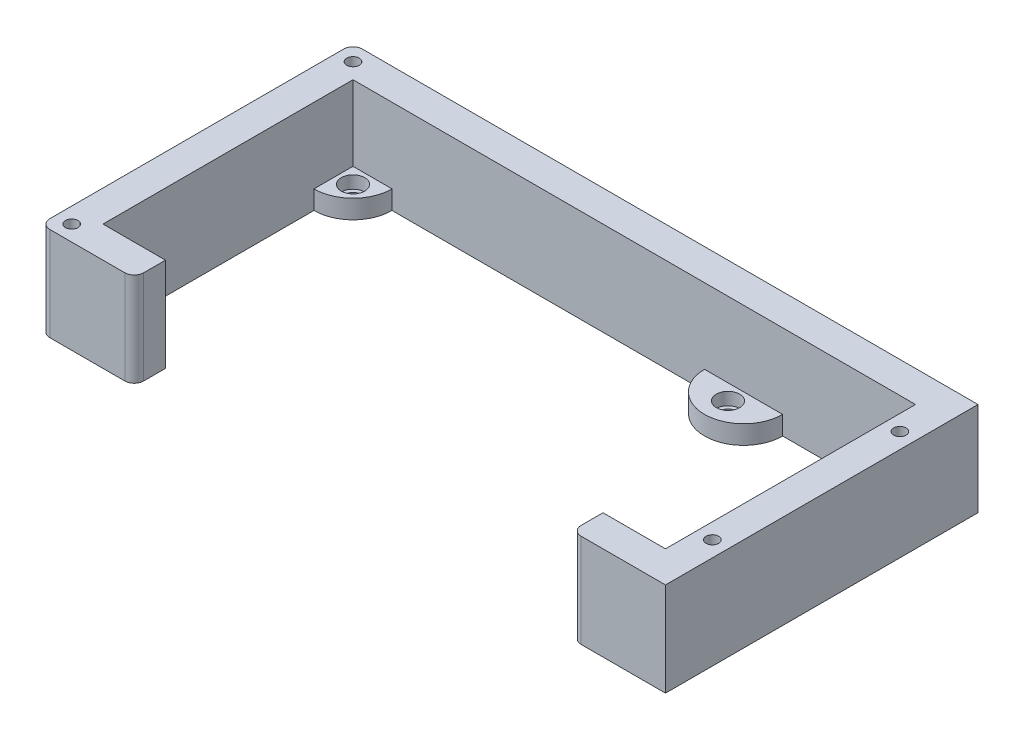
ISO-10303-21;
HEADER;
FILE_DESCRIPTION(('STEP AP214'),'2;1');
FILE_NAME('part.step','',(''),(''),'','','');
FILE_SCHEMA(('AUTOMOTIVE_DESIGN { 1 0 10303 214 1 1 1 1 }'));
ENDSEC;
DATA;
#1=APPLICATION_CONTEXT('core data for automotive mechanical design processes');
#2=APPLICATION_PROTOCOL_DEFINITION('international standard','automotive_design',2000,#1);
#3=PRODUCT_CONTEXT('',#1,'mechanical');
#4=PRODUCT('Part','Part','',(#3));
#5=PRODUCT_RELATED_PRODUCT_CATEGORY('part','',(#4));
#6=PRODUCT_DEFINITION_FORMATION('','',#4);
#7=PRODUCT_DEFINITION_CONTEXT('part definition',#1,'design');
#8=PRODUCT_DEFINITION('design','',#6,#7);
#9=PRODUCT_DEFINITION_SHAPE('','',#8);
#10=(LENGTH_UNIT() NAMED_UNIT(*) SI_UNIT(.MILLI.,.METRE.));
#11=(NAMED_UNIT(*) PLANE_ANGLE_UNIT() SI_UNIT($,.RADIAN.));
#12=(NAMED_UNIT(*) SI_UNIT($,.STERADIAN.) SOLID_ANGLE_UNIT());
#13=UNCERTAINTY_MEASURE_WITH_UNIT(LENGTH_MEASURE(1.E-05),#10,'distance_accuracy_value','');
#14=(GEOMETRIC_REPRESENTATION_CONTEXT(3) GLOBAL_UNCERTAINTY_ASSIGNED_CONTEXT((#13)) GLOBAL_UNIT_ASSIGNED_CONTEXT((#10,
#11,#12)) REPRESENTATION_CONTEXT('',''));
#15=CARTESIAN_POINT('',(0.,0.,0.));
#16=DIRECTION('',(0.,0.,1.));
#17=DIRECTION('',(1.,0.,0.));
#18=AXIS2_PLACEMENT_3D('',#15,#16,#17);
#19=CARTESIAN_POINT('',(-90.,30.,40.));
#20=DIRECTION('',(0.,0.,-1.));
#21=DIRECTION('',(-1.,0.,0.));
#22=AXIS2_PLACEMENT_3D('',#19,#20,#21);
#23=PLANE('',#22);
#24=DIRECTION('',(0.,1.,0.));
#25=VECTOR('',#24,1.);
#26=CARTESIAN_POINT('',(70.,0.,40.));
#27=LINE('',#26,#25);
#28=CARTESIAN_POINT('',(70.,0.,40.));
#29=VERTEX_POINT('',#28);
#30=CARTESIAN_POINT('',(70.,30.,40.));
#31=VERTEX_POINT('',#30);
#32=EDGE_CURVE('E197',#29,#31,#27,.T.);
#33=ORIENTED_EDGE('',*,*,#32,.T.);
#34=DIRECTION('',(1.,0.,0.));
#35=VECTOR('',#34,1.);
#36=CARTESIAN_POINT('',(-90.,30.,40.));
#37=LINE('',#36,#35);
#38=CARTESIAN_POINT('',(90.,30.,40.));
#39=VERTEX_POINT('',#38);
#40=EDGE_CURVE('E426',#31,#39,#37,.T.);
#41=ORIENTED_EDGE('',*,*,#40,.T.);
#42=DIRECTION('',(0.,-1.,0.));
#43=VECTOR('',#42,1.);
#44=CARTESIAN_POINT('',(90.,30.,40.));
#45=LINE('',#44,#43);
#46=CARTESIAN_POINT('',(90.,0.,40.));
#47=VERTEX_POINT('',#46);
#48=EDGE_CURVE('E206',#39,#47,#45,.T.);
#49=ORIENTED_EDGE('',*,*,#48,.T.);
#50=DIRECTION('',(1.,0.,0.));
#51=VECTOR('',#50,1.);
#52=CARTESIAN_POINT('',(-90.,0.,40.));
#53=LINE('',#52,#51);
#54=EDGE_CURVE('E186',#29,#47,#53,.T.);
#55=ORIENTED_EDGE('',*,*,#54,.F.);
#56=EDGE_LOOP('',(#33,#41,#49,#55));
#57=FACE_BOUND('',#56,.T.);
#58=ADVANCED_FACE('F34',(#57),#23,.T.);
#59=CARTESIAN_POINT('',(-100.,30.,50.));
#60=DIRECTION('',(0.,0.,-1.));
#61=DIRECTION('',(-1.,0.,0.));
#62=AXIS2_PLACEMENT_3D('',#59,#60,#61);
#63=PLANE('',#62);
#64=DIRECTION('',(1.,0.,0.));
#65=VECTOR('',#64,1.);
#66=CARTESIAN_POINT('',(-100.,30.,50.));
#67=LINE('',#66,#65);
#68=CARTESIAN_POINT('',(73.,30.,50.));
#69=VERTEX_POINT('',#68);
#70=CARTESIAN_POINT('',(100.,30.,50.));
#71=VERTEX_POINT('',#70);
#72=EDGE_CURVE('E242',#69,#71,#67,.T.);
#73=ORIENTED_EDGE('',*,*,#72,.F.);
#74=DIRECTION('',(0.,1.,0.));
#75=VECTOR('',#74,1.);
#76=CARTESIAN_POINT('',(73.,30.,50.));
#77=LINE('',#76,#75);
#78=CARTESIAN_POINT('',(73.,0.,50.));
#79=VERTEX_POINT('',#78);
#80=EDGE_CURVE('E282',#69,#79,#77,.F.);
#81=ORIENTED_EDGE('',*,*,#80,.T.);
#82=DIRECTION('',(1.,0.,0.));
#83=VECTOR('',#82,1.);
#84=CARTESIAN_POINT('',(-100.,0.,50.));
#85=LINE('',#84,#83);
#86=CARTESIAN_POINT('',(100.,0.,50.));
#87=VERTEX_POINT('',#86);
#88=EDGE_CURVE('E253',#79,#87,#85,.T.);
#89=ORIENTED_EDGE('',*,*,#88,.T.);
#90=DIRECTION('',(0.,-1.,0.));
#91=VECTOR('',#90,1.);
#92=CARTESIAN_POINT('',(100.,30.,50.));
#93=LINE('',#92,#91);
#94=EDGE_CURVE('E246',#71,#87,#93,.T.);
#95=ORIENTED_EDGE('',*,*,#94,.F.);
#96=EDGE_LOOP('',(#73,#81,#89,#95));
#97=FACE_BOUND('',#96,.T.);
#98=ADVANCED_FACE('F477',(#97),#63,.F.);
#99=CARTESIAN_POINT('',(-85.,6.,-35.));
#100=DIRECTION('',(0.,-1.,0.));
#101=DIRECTION('',(0.,0.,-1.));
#102=AXIS2_PLACEMENT_3D('',#99,#100,#101);
#103=CYLINDRICAL_SURFACE('',#102,2.50000000000001);
#104=CARTESIAN_POINT('',(-85.,0.,-35.));
#105=DIRECTION('',(0.,1.,0.));
#106=DIRECTION('',(0.,0.,1.));
#107=AXIS2_PLACEMENT_3D('',#104,#105,#106);
#108=CIRCLE('',#107,2.50000000000001);
#109=CARTESIAN_POINT('',(-85.,0.,-32.5));
#110=VERTEX_POINT('',#109);
#111=EDGE_CURVE('E404',#110,#110,#108,.T.);
#112=ORIENTED_EDGE('',*,*,#111,.F.);
#113=EDGE_LOOP('',(#112));
#114=FACE_BOUND('',#113,.T.);
#115=CARTESIAN_POINT('',(-85.,2.,-35.));
#116=DIRECTION('',(0.,1.,0.));
#117=DIRECTION('',(0.,0.,1.));
#118=AXIS2_PLACEMENT_3D('',#115,#116,#117);
#119=CIRCLE('',#118,2.50000000000001);
#120=CARTESIAN_POINT('',(-85.,2.,-32.5));
#121=VERTEX_POINT('',#120);
#122=EDGE_CURVE('E269',#121,#121,#119,.T.);
#123=ORIENTED_EDGE('',*,*,#122,.T.);
#124=EDGE_LOOP('',(#123));
#125=FACE_BOUND('',#124,.T.);
#126=ADVANCED_FACE('F482',(#114,#125),#103,.F.);
#127=CARTESIAN_POINT('',(35.,6.,-35.));
#128=DIRECTION('',(0.,-1.,0.));
#129=DIRECTION('',(0.,0.,-1.));
#130=AXIS2_PLACEMENT_3D('',#127,#128,#129);
#131=CYLINDRICAL_SURFACE('',#130,2.5);
#132=CARTESIAN_POINT('',(35.,0.,-35.));
#133=DIRECTION('',(0.,1.,0.));
#134=DIRECTION('',(0.,0.,1.));
#135=AXIS2_PLACEMENT_3D('',#132,#133,#134);
#136=CIRCLE('',#135,2.5);
#137=CARTESIAN_POINT('',(35.,0.,-32.5));
#138=VERTEX_POINT('',#137);
#139=EDGE_CURVE('E272',#138,#138,#136,.T.);
#140=ORIENTED_EDGE('',*,*,#139,.F.);
#141=EDGE_LOOP('',(#140));
#142=FACE_BOUND('',#141,.T.);
#143=CARTESIAN_POINT('',(35.,2.,-35.));
#144=DIRECTION('',(0.,1.,0.));
#145=DIRECTION('',(0.,0.,1.));
#146=AXIS2_PLACEMENT_3D('',#143,#144,#145);
#147=CIRCLE('',#146,2.5);
#148=CARTESIAN_POINT('',(35.,2.,-32.5));
#149=VERTEX_POINT('',#148);
#150=EDGE_CURVE('E262',#149,#149,#147,.T.);
#151=ORIENTED_EDGE('',*,*,#150,.T.);
#152=EDGE_LOOP('',(#151));
#153=FACE_BOUND('',#152,.T.);
#154=ADVANCED_FACE('F496',(#142,#153),#131,.F.);
#155=CARTESIAN_POINT('',(-90.,30.,-40.));
#156=DIRECTION('',(0.,0.,1.));
#157=DIRECTION('',(1.,0.,0.));
#158=AXIS2_PLACEMENT_3D('',#155,#156,#157);
#159=PLANE('',#158);
#160=DIRECTION('',(-1.,0.,0.));
#161=VECTOR('',#160,1.);
#162=CARTESIAN_POINT('',(-90.,0.,-40.));
#163=LINE('',#162,#161);
#164=CARTESIAN_POINT('',(22.5,0.,-40.));
#165=VERTEX_POINT('',#164);
#166=CARTESIAN_POINT('',(-77.5000000000001,0.,-40.));
#167=VERTEX_POINT('',#166);
#168=EDGE_CURVE('E422',#165,#167,#163,.T.);
#169=ORIENTED_EDGE('',*,*,#168,.F.);
#170=DIRECTION('',(0.,-1.,0.));
#171=VECTOR('',#170,1.);
#172=CARTESIAN_POINT('',(22.5,6.,-40.));
#173=LINE('',#172,#171);
#174=CARTESIAN_POINT('',(22.5,6.,-40.));
#175=VERTEX_POINT('',#174);
#176=EDGE_CURVE('E381',#175,#165,#173,.T.);
#177=ORIENTED_EDGE('',*,*,#176,.F.);
#178=DIRECTION('',(-1.,0.,0.));
#179=VECTOR('',#178,1.);
#180=CARTESIAN_POINT('',(22.5,6.,-40.));
#181=LINE('',#180,#179);
#182=CARTESIAN_POINT('',(47.5,6.,-40.));
#183=VERTEX_POINT('',#182);
#184=EDGE_CURVE('E379',#183,#175,#181,.T.);
#185=ORIENTED_EDGE('',*,*,#184,.F.);
#186=DIRECTION('',(0.,-1.,0.));
#187=VECTOR('',#186,1.);
#188=CARTESIAN_POINT('',(47.5,6.,-40.));
#189=LINE('',#188,#187);
#190=CARTESIAN_POINT('',(47.4999999999999,0.,-40.));
#191=VERTEX_POINT('',#190);
#192=EDGE_CURVE('E384',#183,#191,#189,.T.);
#193=ORIENTED_EDGE('',*,*,#192,.T.);
#194=CARTESIAN_POINT('',(90.,0.,-40.));
#195=VERTEX_POINT('',#194);
#196=EDGE_CURVE('E214',#195,#191,#163,.T.);
#197=ORIENTED_EDGE('',*,*,#196,.F.);
#198=DIRECTION('',(0.,-1.,0.));
#199=VECTOR('',#198,1.);
#200=CARTESIAN_POINT('',(90.,30.,-40.));
#201=LINE('',#200,#199);
#202=CARTESIAN_POINT('',(90.,30.,-40.));
#203=VERTEX_POINT('',#202);
#204=EDGE_CURVE('E220',#203,#195,#201,.T.);
#205=ORIENTED_EDGE('',*,*,#204,.F.);
#206=DIRECTION('',(-1.,0.,0.));
#207=VECTOR('',#206,1.);
#208=CARTESIAN_POINT('',(-90.,30.,-40.));
#209=LINE('',#208,#207);
#210=CARTESIAN_POINT('',(-90.,30.,-40.));
#211=VERTEX_POINT('',#210);
#212=EDGE_CURVE('E219',#203,#211,#209,.T.);
#213=ORIENTED_EDGE('',*,*,#212,.T.);
#214=DIRECTION('',(0.,-1.,0.));
#215=VECTOR('',#214,1.);
#216=CARTESIAN_POINT('',(-90.,30.,-40.));
#217=LINE('',#216,#215);
#218=CARTESIAN_POINT('',(-90.,6.,-40.));
#219=VERTEX_POINT('',#218);
#220=EDGE_CURVE('E228',#211,#219,#217,.T.);
#221=ORIENTED_EDGE('',*,*,#220,.T.);
#222=DIRECTION('',(-1.,0.,0.));
#223=VECTOR('',#222,1.);
#224=CARTESIAN_POINT('',(-90.,6.,-40.));
#225=LINE('',#224,#223);
#226=CARTESIAN_POINT('',(-77.5000000000001,6.,-40.));
#227=VERTEX_POINT('',#226);
#228=EDGE_CURVE('E412',#227,#219,#225,.T.);
#229=ORIENTED_EDGE('',*,*,#228,.F.);
#230=DIRECTION('',(0.,-1.,0.));
#231=VECTOR('',#230,1.);
#232=CARTESIAN_POINT('',(-77.5000000000001,6.,-40.));
#233=LINE('',#232,#231);
#234=EDGE_CURVE('E414',#227,#167,#233,.T.);
#235=ORIENTED_EDGE('',*,*,#234,.T.);
#236=EDGE_LOOP('',(#169,#177,#185,#193,#197,#205,#213,#221,#229,#235));
#237=FACE_BOUND('',#236,.T.);
#238=ADVANCED_FACE('F441',(#237),#159,.T.);
#239=CARTESIAN_POINT('',(-90.,30.,-40.));
#240=DIRECTION('',(1.,0.,0.));
#241=DIRECTION('',(0.,0.,-1.));
#242=AXIS2_PLACEMENT_3D('',#239,#240,#241);
#243=PLANE('',#242);
#244=DIRECTION('',(0.,-1.,0.));
#245=VECTOR('',#244,1.);
#246=CARTESIAN_POINT('',(-90.,30.,40.));
#247=LINE('',#246,#245);
#248=CARTESIAN_POINT('',(-90.,30.,40.));
#249=VERTEX_POINT('',#248);
#250=CARTESIAN_POINT('',(-90.,6.,40.));
#251=VERTEX_POINT('',#250);
#252=EDGE_CURVE('E225',#249,#251,#247,.T.);
#253=ORIENTED_EDGE('',*,*,#252,.T.);
#254=DIRECTION('',(0.,0.,1.));
#255=VECTOR('',#254,1.);
#256=CARTESIAN_POINT('',(-90.,6.,40.));
#257=LINE('',#256,#255);
#258=CARTESIAN_POINT('',(-90.,6.,27.5));
#259=VERTEX_POINT('',#258);
#260=EDGE_CURVE('E395',#259,#251,#257,.T.);
#261=ORIENTED_EDGE('',*,*,#260,.F.);
#262=DIRECTION('',(0.,-1.,0.));
#263=VECTOR('',#262,1.);
#264=CARTESIAN_POINT('',(-90.,6.,27.5));
#265=LINE('',#264,#263);
#266=CARTESIAN_POINT('',(-90.,0.,27.5));
#267=VERTEX_POINT('',#266);
#268=EDGE_CURVE('E397',#259,#267,#265,.T.);
#269=ORIENTED_EDGE('',*,*,#268,.T.);
#270=DIRECTION('',(0.,0.,1.));
#271=VECTOR('',#270,1.);
#272=CARTESIAN_POINT('',(-90.,0.,-40.));
#273=LINE('',#272,#271);
#274=CARTESIAN_POINT('',(-90.,0.,-27.5));
#275=VERTEX_POINT('',#274);
#276=EDGE_CURVE('E209',#275,#267,#273,.T.);
#277=ORIENTED_EDGE('',*,*,#276,.F.);
#278=DIRECTION('',(0.,-1.,0.));
#279=VECTOR('',#278,1.);
#280=CARTESIAN_POINT('',(-90.,6.,-27.5));
#281=LINE('',#280,#279);
#282=CARTESIAN_POINT('',(-90.,6.,-27.5));
#283=VERTEX_POINT('',#282);
#284=EDGE_CURVE('E419',#283,#275,#281,.T.);
#285=ORIENTED_EDGE('',*,*,#284,.F.);
#286=DIRECTION('',(0.,0.,1.));
#287=VECTOR('',#286,1.);
#288=CARTESIAN_POINT('',(-90.,6.,-40.));
#289=LINE('',#288,#287);
#290=EDGE_CURVE('E408',#219,#283,#289,.T.);
#291=ORIENTED_EDGE('',*,*,#290,.F.);
#292=ORIENTED_EDGE('',*,*,#220,.F.);
#293=DIRECTION('',(0.,0.,1.));
#294=VECTOR('',#293,1.);
#295=CARTESIAN_POINT('',(-90.,30.,-40.));
#296=LINE('',#295,#294);
#297=EDGE_CURVE('E424',#211,#249,#296,.T.);
#298=ORIENTED_EDGE('',*,*,#297,.T.);
#299=EDGE_LOOP('',(#253,#261,#269,#277,#285,#291,#292,#298));
#300=FACE_BOUND('',#299,.T.);
#301=ADVANCED_FACE('F447',(#300),#243,.T.);
#302=DIRECTION('',(0.,1.,0.));
#303=VECTOR('',#302,1.);
#304=CARTESIAN_POINT('',(-70.,0.,40.));
#305=LINE('',#304,#303);
#306=CARTESIAN_POINT('',(-70.,0.,40.));
#307=VERTEX_POINT('',#306);
#308=CARTESIAN_POINT('',(-70.,30.,40.));
#309=VERTEX_POINT('',#308);
#310=EDGE_CURVE('E203',#307,#309,#305,.T.);
#311=ORIENTED_EDGE('',*,*,#310,.F.);
#312=CARTESIAN_POINT('',(-77.5000000000001,0.,40.));
#313=VERTEX_POINT('',#312);
#314=EDGE_CURVE('E208',#313,#307,#53,.T.);
#315=ORIENTED_EDGE('',*,*,#314,.F.);
#316=DIRECTION('',(0.,-1.,0.));
#317=VECTOR('',#316,1.);
#318=CARTESIAN_POINT('',(-77.5000000000001,6.,40.));
#319=LINE('',#318,#317);
#320=CARTESIAN_POINT('',(-77.5000000000001,6.,40.));
#321=VERTEX_POINT('',#320);
#322=EDGE_CURVE('E401',#321,#313,#319,.T.);
#323=ORIENTED_EDGE('',*,*,#322,.F.);
#324=DIRECTION('',(1.,0.,0.));
#325=VECTOR('',#324,1.);
#326=CARTESIAN_POINT('',(-90.,6.,40.));
#327=LINE('',#326,#325);
#328=EDGE_CURVE('E391',#251,#321,#327,.T.);
#329=ORIENTED_EDGE('',*,*,#328,.F.);
#330=ORIENTED_EDGE('',*,*,#252,.F.);
#331=EDGE_CURVE('E427',#249,#309,#37,.T.);
#332=ORIENTED_EDGE('',*,*,#331,.T.);
#333=EDGE_LOOP('',(#311,#315,#323,#329,#330,#332));
#334=FACE_BOUND('',#333,.T.);
#335=ADVANCED_FACE('F458',(#334),#23,.T.);
#336=CARTESIAN_POINT('',(0.,30.,0.));
#337=DIRECTION('',(0.,1.,0.));
#338=DIRECTION('',(0.,0.,1.));
#339=AXIS2_PLACEMENT_3D('',#336,#337,#338);
#340=PLANE('',#339);
#341=DIRECTION('',(0.,0.,-1.));
#342=VECTOR('',#341,1.);
#343=CARTESIAN_POINT('',(70.,30.,40.));
#344=LINE('',#343,#342);
#345=CARTESIAN_POINT('',(70.,30.,47.));
#346=VERTEX_POINT('',#345);
#347=EDGE_CURVE('E200',#346,#31,#344,.T.);
#348=ORIENTED_EDGE('',*,*,#347,.F.);
#349=CARTESIAN_POINT('',(73.,30.,47.));
#350=DIRECTION('',(0.,1.,0.));
#351=DIRECTION('',(0.,0.,1.));
#352=AXIS2_PLACEMENT_3D('',#349,#350,#351);
#353=CIRCLE('',#352,3.);
#354=EDGE_CURVE('E280',#346,#69,#353,.T.);
#355=ORIENTED_EDGE('',*,*,#354,.T.);
#356=ORIENTED_EDGE('',*,*,#72,.T.);
#357=DIRECTION('',(0.,0.,-1.));
#358=VECTOR('',#357,1.);
#359=CARTESIAN_POINT('',(100.,30.,-50.));
#360=LINE('',#359,#358);
#361=CARTESIAN_POINT('',(100.,30.,-50.));
#362=VERTEX_POINT('',#361);
#363=EDGE_CURVE('E232',#71,#362,#360,.T.);
#364=ORIENTED_EDGE('',*,*,#363,.T.);
#365=DIRECTION('',(-1.,0.,0.));
#366=VECTOR('',#365,1.);
#367=CARTESIAN_POINT('',(-100.,30.,-50.));
#368=LINE('',#367,#366);
#369=CARTESIAN_POINT('',(-97.,30.,-50.));
#370=VERTEX_POINT('',#369);
#371=EDGE_CURVE('E235',#362,#370,#368,.T.);
#372=ORIENTED_EDGE('',*,*,#371,.T.);
#373=CARTESIAN_POINT('',(-97.,30.,-47.));
#374=DIRECTION('',(0.,1.,0.));
#375=DIRECTION('',(0.,0.,1.));
#376=AXIS2_PLACEMENT_3D('',#373,#374,#375);
#377=CIRCLE('',#376,3.);
#378=CARTESIAN_POINT('',(-100.,30.,-47.));
#379=VERTEX_POINT('',#378);
#380=EDGE_CURVE('E274',#370,#379,#377,.T.);
#381=ORIENTED_EDGE('',*,*,#380,.T.);
#382=DIRECTION('',(0.,0.,1.));
#383=VECTOR('',#382,1.);
#384=CARTESIAN_POINT('',(-100.,30.,-50.));
#385=LINE('',#384,#383);
#386=CARTESIAN_POINT('',(-100.,30.,47.));
#387=VERTEX_POINT('',#386);
#388=EDGE_CURVE('E239',#379,#387,#385,.T.);
#389=ORIENTED_EDGE('',*,*,#388,.T.);
#390=CARTESIAN_POINT('',(-97.,30.,47.));
#391=DIRECTION('',(0.,1.,0.));
#392=DIRECTION('',(0.,0.,1.));
#393=AXIS2_PLACEMENT_3D('',#390,#391,#392);
#394=CIRCLE('',#393,3.);
#395=CARTESIAN_POINT('',(-97.,30.,50.));
#396=VERTEX_POINT('',#395);
#397=EDGE_CURVE('E276',#387,#396,#394,.T.);
#398=ORIENTED_EDGE('',*,*,#397,.T.);
#399=CARTESIAN_POINT('',(-73.,30.,50.));
#400=VERTEX_POINT('',#399);
#401=EDGE_CURVE('E243',#396,#400,#67,.T.);
#402=ORIENTED_EDGE('',*,*,#401,.T.);
#403=CARTESIAN_POINT('',(-73.,30.,47.));
#404=DIRECTION('',(0.,1.,0.));
#405=DIRECTION('',(0.,0.,1.));
#406=AXIS2_PLACEMENT_3D('',#403,#404,#405);
#407=CIRCLE('',#406,3.);
#408=CARTESIAN_POINT('',(-70.,30.,47.));
#409=VERTEX_POINT('',#408);
#410=EDGE_CURVE('E278',#400,#409,#407,.T.);
#411=ORIENTED_EDGE('',*,*,#410,.T.);
#412=DIRECTION('',(0.,0.,1.));
#413=VECTOR('',#412,1.);
#414=CARTESIAN_POINT('',(-70.,30.,40.));
#415=LINE('',#414,#413);
#416=EDGE_CURVE('E194',#309,#409,#415,.T.);
#417=ORIENTED_EDGE('',*,*,#416,.F.);
#418=ORIENTED_EDGE('',*,*,#331,.F.);
#419=ORIENTED_EDGE('',*,*,#297,.F.);
#420=ORIENTED_EDGE('',*,*,#212,.F.);
#421=DIRECTION('',(0.,0.,-1.));
#422=VECTOR('',#421,1.);
#423=CARTESIAN_POINT('',(90.,30.,-40.));
#424=LINE('',#423,#422);
#425=EDGE_CURVE('E223',#39,#203,#424,.T.);
#426=ORIENTED_EDGE('',*,*,#425,.F.);
#427=ORIENTED_EDGE('',*,*,#40,.F.);
#428=EDGE_LOOP('',(#348,#355,#356,#364,#372,#381,#389,#398,#402,#411,#417,#418,#419,#420,#426,#427));
#429=FACE_BOUND('',#428,.T.);
#430=CARTESIAN_POINT('',(-95.,30.,-45.));
#431=DIRECTION('',(0.,1.,0.));
#432=DIRECTION('',(0.,0.,1.));
#433=AXIS2_PLACEMENT_3D('',#430,#431,#432);
#434=CIRCLE('',#433,2.);
#435=CARTESIAN_POINT('',(-95.,30.,-43.));
#436=VERTEX_POINT('',#435);
#437=EDGE_CURVE('E338',#436,#436,#434,.T.);
#438=ORIENTED_EDGE('',*,*,#437,.F.);
#439=EDGE_LOOP('',(#438));
#440=FACE_BOUND('',#439,.T.);
#441=CARTESIAN_POINT('',(95.,30.,30.));
#442=DIRECTION('',(0.,1.,0.));
#443=DIRECTION('',(0.,0.,-1.));
#444=AXIS2_PLACEMENT_3D('',#441,#442,#443);
#445=CIRCLE('',#444,2.);
#446=CARTESIAN_POINT('',(95.,30.,28.));
#447=VERTEX_POINT('',#446);
#448=EDGE_CURVE('E332',#447,#447,#445,.T.);
#449=ORIENTED_EDGE('',*,*,#448,.F.);
#450=EDGE_LOOP('',(#449));
#451=FACE_BOUND('',#450,.T.);
#452=CARTESIAN_POINT('',(95.,30.,-30.));
#453=DIRECTION('',(0.,1.,0.));
#454=DIRECTION('',(0.,0.,1.));
#455=AXIS2_PLACEMENT_3D('',#452,#453,#454);
#456=CIRCLE('',#455,2.);
#457=CARTESIAN_POINT('',(95.,30.,-28.));
#458=VERTEX_POINT('',#457);
#459=EDGE_CURVE('E345',#458,#458,#456,.T.);
#460=ORIENTED_EDGE('',*,*,#459,.F.);
#461=EDGE_LOOP('',(#460));
#462=FACE_BOUND('',#461,.T.);
#463=CARTESIAN_POINT('',(-95.,30.,45.));
#464=DIRECTION('',(0.,1.,0.));
#465=DIRECTION('',(0.,0.,-1.));
#466=AXIS2_PLACEMENT_3D('',#463,#464,#465);
#467=CIRCLE('',#466,2.);
#468=CARTESIAN_POINT('',(-95.,30.,43.));
#469=VERTEX_POINT('',#468);
#470=EDGE_CURVE('E350',#469,#469,#467,.T.);
#471=ORIENTED_EDGE('',*,*,#470,.F.);
#472=EDGE_LOOP('',(#471));
#473=FACE_BOUND('',#472,.T.);
#474=ADVANCED_FACE('F307',(#429,#440,#451,#462,#473),#340,.T.);
#475=CARTESIAN_POINT('',(0.,0.,0.));
#476=DIRECTION('',(0.,1.,0.));
#477=DIRECTION('',(0.,0.,1.));
#478=AXIS2_PLACEMENT_3D('',#475,#476,#477);
#479=PLANE('',#478);
#480=ORIENTED_EDGE('',*,*,#88,.F.);
#481=CARTESIAN_POINT('',(73.,0.,47.));
#482=DIRECTION('',(0.,1.,0.));
#483=DIRECTION('',(0.,0.,1.));
#484=AXIS2_PLACEMENT_3D('',#481,#482,#483);
#485=CIRCLE('',#484,3.);
#486=CARTESIAN_POINT('',(70.,0.,47.));
#487=VERTEX_POINT('',#486);
#488=EDGE_CURVE('E189',#79,#487,#485,.F.);
#489=ORIENTED_EDGE('',*,*,#488,.T.);
#490=DIRECTION('',(0.,0.,-1.));
#491=VECTOR('',#490,1.);
#492=CARTESIAN_POINT('',(70.,0.,40.));
#493=LINE('',#492,#491);
#494=EDGE_CURVE('E179',#487,#29,#493,.T.);
#495=ORIENTED_EDGE('',*,*,#494,.T.);
#496=ORIENTED_EDGE('',*,*,#54,.T.);
#497=DIRECTION('',(0.,0.,-1.));
#498=VECTOR('',#497,1.);
#499=CARTESIAN_POINT('',(90.,0.,-40.));
#500=LINE('',#499,#498);
#501=EDGE_CURVE('E212',#47,#195,#500,.T.);
#502=ORIENTED_EDGE('',*,*,#501,.T.);
#503=ORIENTED_EDGE('',*,*,#196,.T.);
#504=CARTESIAN_POINT('',(35.,0.,-40.));
#505=DIRECTION('',(0.,1.,0.));
#506=DIRECTION('',(0.,0.,1.));
#507=AXIS2_PLACEMENT_3D('',#504,#505,#506);
#508=CIRCLE('',#507,12.5);
#509=EDGE_CURVE('E376',#165,#191,#508,.T.);
#510=ORIENTED_EDGE('',*,*,#509,.F.);
#511=ORIENTED_EDGE('',*,*,#168,.T.);
#512=CARTESIAN_POINT('',(-90.,0.,-40.));
#513=DIRECTION('',(0.,1.,0.));
#514=DIRECTION('',(0.,0.,1.));
#515=AXIS2_PLACEMENT_3D('',#512,#513,#514);
#516=CIRCLE('',#515,12.5);
#517=EDGE_CURVE('E407',#275,#167,#516,.T.);
#518=ORIENTED_EDGE('',*,*,#517,.F.);
#519=ORIENTED_EDGE('',*,*,#276,.T.);
#520=CARTESIAN_POINT('',(-90.,0.,40.));
#521=DIRECTION('',(0.,1.,0.));
#522=DIRECTION('',(0.,0.,-1.));
#523=AXIS2_PLACEMENT_3D('',#520,#521,#522);
#524=CIRCLE('',#523,12.5);
#525=EDGE_CURVE('E390',#313,#267,#524,.T.);
#526=ORIENTED_EDGE('',*,*,#525,.F.);
#527=ORIENTED_EDGE('',*,*,#314,.T.);
#528=DIRECTION('',(0.,0.,1.));
#529=VECTOR('',#528,1.);
#530=CARTESIAN_POINT('',(-70.,0.,40.));
#531=LINE('',#530,#529);
#532=CARTESIAN_POINT('',(-70.,0.,47.));
#533=VERTEX_POINT('',#532);
#534=EDGE_CURVE('E193',#307,#533,#531,.T.);
#535=ORIENTED_EDGE('',*,*,#534,.T.);
#536=CARTESIAN_POINT('',(-73.,0.,47.));
#537=DIRECTION('',(0.,1.,0.));
#538=DIRECTION('',(0.,0.,1.));
#539=AXIS2_PLACEMENT_3D('',#536,#537,#538);
#540=CIRCLE('',#539,3.);
#541=CARTESIAN_POINT('',(-73.,0.,50.));
#542=VERTEX_POINT('',#541);
#543=EDGE_CURVE('E286',#533,#542,#540,.F.);
#544=ORIENTED_EDGE('',*,*,#543,.T.);
#545=CARTESIAN_POINT('',(-97.,0.,50.));
#546=VERTEX_POINT('',#545);
#547=EDGE_CURVE('E236',#546,#542,#85,.T.);
#548=ORIENTED_EDGE('',*,*,#547,.F.);
#549=CARTESIAN_POINT('',(-97.,0.,47.));
#550=DIRECTION('',(0.,1.,0.));
#551=DIRECTION('',(0.,0.,1.));
#552=AXIS2_PLACEMENT_3D('',#549,#550,#551);
#553=CIRCLE('',#552,3.);
#554=CARTESIAN_POINT('',(-100.,0.,47.));
#555=VERTEX_POINT('',#554);
#556=EDGE_CURVE('E55',#546,#555,#553,.F.);
#557=ORIENTED_EDGE('',*,*,#556,.T.);
#558=DIRECTION('',(0.,0.,1.));
#559=VECTOR('',#558,1.);
#560=CARTESIAN_POINT('',(-100.,0.,-50.));
#561=LINE('',#560,#559);
#562=CARTESIAN_POINT('',(-100.,0.,-47.));
#563=VERTEX_POINT('',#562);
#564=EDGE_CURVE('E251',#563,#555,#561,.T.);
#565=ORIENTED_EDGE('',*,*,#564,.F.);
#566=CARTESIAN_POINT('',(-97.,0.,-47.));
#567=DIRECTION('',(0.,1.,0.));
#568=DIRECTION('',(0.,0.,1.));
#569=AXIS2_PLACEMENT_3D('',#566,#567,#568);
#570=CIRCLE('',#569,3.);
#571=CARTESIAN_POINT('',(-97.,0.,-50.));
#572=VERTEX_POINT('',#571);
#573=EDGE_CURVE('E49',#563,#572,#570,.F.);
#574=ORIENTED_EDGE('',*,*,#573,.T.);
#575=DIRECTION('',(-1.,0.,0.));
#576=VECTOR('',#575,1.);
#577=CARTESIAN_POINT('',(-100.,0.,-50.));
#578=LINE('',#577,#576);
#579=CARTESIAN_POINT('',(100.,0.,-50.));
#580=VERTEX_POINT('',#579);
#581=EDGE_CURVE('E249',#580,#572,#578,.T.);
#582=ORIENTED_EDGE('',*,*,#581,.F.);
#583=DIRECTION('',(0.,0.,-1.));
#584=VECTOR('',#583,1.);
#585=CARTESIAN_POINT('',(100.,0.,-50.));
#586=LINE('',#585,#584);
#587=EDGE_CURVE('E231',#87,#580,#586,.T.);
#588=ORIENTED_EDGE('',*,*,#587,.F.);
#589=EDGE_LOOP('',(#480,#489,#495,#496,#502,#503,#510,#511,#518,#519,#526,#527,#535,#544,#548,
#557,#565,#574,#582,#588));
#590=FACE_BOUND('',#589,.T.);
#591=ORIENTED_EDGE('',*,*,#111,.T.);
#592=EDGE_LOOP('',(#591));
#593=FACE_BOUND('',#592,.T.);
#594=CARTESIAN_POINT('',(-85.,0.,35.));
#595=DIRECTION('',(0.,1.,0.));
#596=DIRECTION('',(0.,0.,-1.));
#597=AXIS2_PLACEMENT_3D('',#594,#595,#596);
#598=CIRCLE('',#597,2.50000000000001);
#599=CARTESIAN_POINT('',(-85.,0.,32.5));
#600=VERTEX_POINT('',#599);
#601=EDGE_CURVE('E387',#600,#600,#598,.T.);
#602=ORIENTED_EDGE('',*,*,#601,.T.);
#603=EDGE_LOOP('',(#602));
#604=FACE_BOUND('',#603,.T.);
#605=ORIENTED_EDGE('',*,*,#139,.T.);
#606=EDGE_LOOP('',(#605));
#607=FACE_BOUND('',#606,.T.);
#608=ADVANCED_FACE('F182',(#590,#593,#604,#607),#479,.F.);
#609=CARTESIAN_POINT('',(100.,30.,-50.));
#610=DIRECTION('',(-1.,0.,0.));
#611=DIRECTION('',(0.,0.,1.));
#612=AXIS2_PLACEMENT_3D('',#609,#610,#611);
#613=PLANE('',#612);
#614=ORIENTED_EDGE('',*,*,#587,.T.);
#615=DIRECTION('',(0.,-1.,0.));
#616=VECTOR('',#615,1.);
#617=CARTESIAN_POINT('',(100.,30.,-50.));
#618=LINE('',#617,#616);
#619=EDGE_CURVE('E258',#362,#580,#618,.T.);
#620=ORIENTED_EDGE('',*,*,#619,.F.);
#621=ORIENTED_EDGE('',*,*,#363,.F.);
#622=ORIENTED_EDGE('',*,*,#94,.T.);
#623=EDGE_LOOP('',(#614,#620,#621,#622));
#624=FACE_BOUND('',#623,.T.);
#625=ADVANCED_FACE('F500',(#624),#613,.F.);
#626=CARTESIAN_POINT('',(-100.,30.,-50.));
#627=DIRECTION('',(0.,0.,1.));
#628=DIRECTION('',(1.,0.,0.));
#629=AXIS2_PLACEMENT_3D('',#626,#627,#628);
#630=PLANE('',#629);
#631=ORIENTED_EDGE('',*,*,#581,.T.);
#632=DIRECTION('',(0.,-1.,0.));
#633=VECTOR('',#632,1.);
#634=CARTESIAN_POINT('',(-97.,30.,-50.));
#635=LINE('',#634,#633);
#636=EDGE_CURVE('E11',#572,#370,#635,.F.);
#637=ORIENTED_EDGE('',*,*,#636,.T.);
#638=ORIENTED_EDGE('',*,*,#371,.F.);
#639=ORIENTED_EDGE('',*,*,#619,.T.);
#640=EDGE_LOOP('',(#631,#637,#638,#639));
#641=FACE_BOUND('',#640,.T.);
#642=ADVANCED_FACE('F506',(#641),#630,.F.);
#643=CARTESIAN_POINT('',(-100.,30.,-50.));
#644=DIRECTION('',(1.,0.,0.));
#645=DIRECTION('',(0.,0.,-1.));
#646=AXIS2_PLACEMENT_3D('',#643,#644,#645);
#647=PLANE('',#646);
#648=ORIENTED_EDGE('',*,*,#564,.T.);
#649=DIRECTION('',(0.,-1.,0.));
#650=VECTOR('',#649,1.);
#651=CARTESIAN_POINT('',(-100.,30.,47.));
#652=LINE('',#651,#650);
#653=EDGE_CURVE('E42',#555,#387,#652,.F.);
#654=ORIENTED_EDGE('',*,*,#653,.T.);
#655=ORIENTED_EDGE('',*,*,#388,.F.);
#656=DIRECTION('',(0.,-1.,0.));
#657=VECTOR('',#656,1.);
#658=CARTESIAN_POINT('',(-100.,30.,-47.));
#659=LINE('',#658,#657);
#660=EDGE_CURVE('E297',#379,#563,#659,.T.);
#661=ORIENTED_EDGE('',*,*,#660,.T.);
#662=EDGE_LOOP('',(#648,#654,#655,#661));
#663=FACE_BOUND('',#662,.T.);
#664=ADVANCED_FACE('F302',(#663),#647,.F.);
#665=ORIENTED_EDGE('',*,*,#547,.T.);
#666=DIRECTION('',(0.,1.,0.));
#667=VECTOR('',#666,1.);
#668=CARTESIAN_POINT('',(-73.,30.,50.));
#669=LINE('',#668,#667);
#670=EDGE_CURVE('E292',#542,#400,#669,.T.);
#671=ORIENTED_EDGE('',*,*,#670,.T.);
#672=ORIENTED_EDGE('',*,*,#401,.F.);
#673=DIRECTION('',(0.,-1.,0.));
#674=VECTOR('',#673,1.);
#675=CARTESIAN_POINT('',(-97.,30.,50.));
#676=LINE('',#675,#674);
#677=EDGE_CURVE('E289',#396,#546,#676,.T.);
#678=ORIENTED_EDGE('',*,*,#677,.T.);
#679=EDGE_LOOP('',(#665,#671,#672,#678));
#680=FACE_BOUND('',#679,.T.);
#681=ADVANCED_FACE('F314',(#680),#63,.F.);
#682=CARTESIAN_POINT('',(90.,30.,-40.));
#683=DIRECTION('',(-1.,0.,0.));
#684=DIRECTION('',(0.,0.,1.));
#685=AXIS2_PLACEMENT_3D('',#682,#683,#684);
#686=PLANE('',#685);
#687=ORIENTED_EDGE('',*,*,#501,.F.);
#688=ORIENTED_EDGE('',*,*,#48,.F.);
#689=ORIENTED_EDGE('',*,*,#425,.T.);
#690=ORIENTED_EDGE('',*,*,#204,.T.);
#691=EDGE_LOOP('',(#687,#688,#689,#690));
#692=FACE_BOUND('',#691,.T.);
#693=ADVANCED_FACE('F503',(#692),#686,.T.);
#694=CARTESIAN_POINT('',(-90.,6.,-40.));
#695=DIRECTION('',(0.,1.,0.));
#696=DIRECTION('',(0.,0.,1.));
#697=AXIS2_PLACEMENT_3D('',#694,#695,#696);
#698=PLANE('',#697);
#699=CARTESIAN_POINT('',(-85.,6.,-35.));
#700=DIRECTION('',(0.,1.,0.));
#701=DIRECTION('',(0.,0.,1.));
#702=AXIS2_PLACEMENT_3D('',#699,#700,#701);
#703=CIRCLE('',#702,3.75000000000001);
#704=CARTESIAN_POINT('',(-85.,6.,-31.25));
#705=VERTEX_POINT('',#704);
#706=EDGE_CURVE('E361',#705,#705,#703,.T.);
#707=ORIENTED_EDGE('',*,*,#706,.F.);
#708=EDGE_LOOP('',(#707));
#709=FACE_BOUND('',#708,.T.);
#710=ORIENTED_EDGE('',*,*,#290,.T.);
#711=CARTESIAN_POINT('',(-90.,6.,-40.));
#712=DIRECTION('',(0.,1.,0.));
#713=DIRECTION('',(0.,0.,1.));
#714=AXIS2_PLACEMENT_3D('',#711,#712,#713);
#715=CIRCLE('',#714,12.5);
#716=EDGE_CURVE('E410',#283,#227,#715,.T.);
#717=ORIENTED_EDGE('',*,*,#716,.T.);
#718=ORIENTED_EDGE('',*,*,#228,.T.);
#719=EDGE_LOOP('',(#710,#717,#718));
#720=FACE_BOUND('',#719,.T.);
#721=ADVANCED_FACE('F445',(#709,#720),#698,.T.);
#722=CARTESIAN_POINT('',(-90.,6.,-40.));
#723=DIRECTION('',(0.,-1.,0.));
#724=DIRECTION('',(0.,0.,-1.));
#725=AXIS2_PLACEMENT_3D('',#722,#723,#724);
#726=CYLINDRICAL_SURFACE('',#725,12.5);
#727=ORIENTED_EDGE('',*,*,#517,.T.);
#728=ORIENTED_EDGE('',*,*,#234,.F.);
#729=ORIENTED_EDGE('',*,*,#716,.F.);
#730=ORIENTED_EDGE('',*,*,#284,.T.);
#731=EDGE_LOOP('',(#727,#728,#729,#730));
#732=FACE_BOUND('',#731,.T.);
#733=ADVANCED_FACE('F436',(#732),#726,.T.);
#734=CARTESIAN_POINT('',(-90.,6.,40.));
#735=DIRECTION('',(0.,-1.,0.));
#736=DIRECTION('',(0.,0.,-1.));
#737=AXIS2_PLACEMENT_3D('',#734,#735,#736);
#738=PLANE('',#737);
#739=CARTESIAN_POINT('',(-85.,6.,35.));
#740=DIRECTION('',(0.,1.,0.));
#741=DIRECTION('',(0.,0.,-1.));
#742=AXIS2_PLACEMENT_3D('',#739,#740,#741);
#743=CIRCLE('',#742,3.75000000000001);
#744=CARTESIAN_POINT('',(-85.,6.,31.25));
#745=VERTEX_POINT('',#744);
#746=EDGE_CURVE('E337',#745,#745,#743,.T.);
#747=ORIENTED_EDGE('',*,*,#746,.F.);
#748=EDGE_LOOP('',(#747));
#749=FACE_BOUND('',#748,.T.);
#750=ORIENTED_EDGE('',*,*,#328,.T.);
#751=CARTESIAN_POINT('',(-90.,6.,40.));
#752=DIRECTION('',(0.,1.,0.));
#753=DIRECTION('',(0.,0.,-1.));
#754=AXIS2_PLACEMENT_3D('',#751,#752,#753);
#755=CIRCLE('',#754,12.5);
#756=EDGE_CURVE('E393',#321,#259,#755,.T.);
#757=ORIENTED_EDGE('',*,*,#756,.T.);
#758=ORIENTED_EDGE('',*,*,#260,.T.);
#759=EDGE_LOOP('',(#750,#757,#758));
#760=FACE_BOUND('',#759,.T.);
#761=ADVANCED_FACE('F463',(#749,#760),#738,.F.);
#762=CARTESIAN_POINT('',(-90.,6.,40.));
#763=DIRECTION('',(0.,-1.,0.));
#764=DIRECTION('',(0.,0.,-1.));
#765=AXIS2_PLACEMENT_3D('',#762,#763,#764);
#766=CYLINDRICAL_SURFACE('',#765,12.5);
#767=ORIENTED_EDGE('',*,*,#525,.T.);
#768=ORIENTED_EDGE('',*,*,#268,.F.);
#769=ORIENTED_EDGE('',*,*,#756,.F.);
#770=ORIENTED_EDGE('',*,*,#322,.T.);
#771=EDGE_LOOP('',(#767,#768,#769,#770));
#772=FACE_BOUND('',#771,.T.);
#773=ADVANCED_FACE('F455',(#772),#766,.T.);
#774=CARTESIAN_POINT('',(-85.,6.,35.));
#775=DIRECTION('',(0.,-1.,0.));
#776=DIRECTION('',(0.,0.,-1.));
#777=AXIS2_PLACEMENT_3D('',#774,#775,#776);
#778=CYLINDRICAL_SURFACE('',#777,2.50000000000001);
#779=CARTESIAN_POINT('',(-85.,2.,35.));
#780=DIRECTION('',(0.,-1.,0.));
#781=DIRECTION('',(0.,0.,-1.));
#782=AXIS2_PLACEMENT_3D('',#779,#780,#781);
#783=CIRCLE('',#782,2.50000000000001);
#784=CARTESIAN_POINT('',(-85.,2.,32.5));
#785=VERTEX_POINT('',#784);
#786=EDGE_CURVE('E265',#785,#785,#783,.T.);
#787=ORIENTED_EDGE('',*,*,#786,.F.);
#788=EDGE_LOOP('',(#787));
#789=FACE_BOUND('',#788,.T.);
#790=ORIENTED_EDGE('',*,*,#601,.F.);
#791=EDGE_LOOP('',(#790));
#792=FACE_BOUND('',#791,.T.);
#793=ADVANCED_FACE('F471',(#789,#792),#778,.F.);
#794=CARTESIAN_POINT('',(35.,6.,-40.));
#795=DIRECTION('',(0.,1.,0.));
#796=DIRECTION('',(0.,0.,1.));
#797=AXIS2_PLACEMENT_3D('',#794,#795,#796);
#798=PLANE('',#797);
#799=CARTESIAN_POINT('',(35.,6.,-35.));
#800=DIRECTION('',(0.,1.,0.));
#801=DIRECTION('',(0.,0.,1.));
#802=AXIS2_PLACEMENT_3D('',#799,#800,#801);
#803=CIRCLE('',#802,3.75000000000001);
#804=CARTESIAN_POINT('',(35.,6.,-31.25));
#805=VERTEX_POINT('',#804);
#806=EDGE_CURVE('E362',#805,#805,#803,.T.);
#807=ORIENTED_EDGE('',*,*,#806,.F.);
#808=EDGE_LOOP('',(#807));
#809=FACE_BOUND('',#808,.T.);
#810=CARTESIAN_POINT('',(35.,6.,-40.));
#811=DIRECTION('',(0.,1.,0.));
#812=DIRECTION('',(0.,0.,1.));
#813=AXIS2_PLACEMENT_3D('',#810,#811,#812);
#814=CIRCLE('',#813,12.5);
#815=EDGE_CURVE('E377',#175,#183,#814,.T.);
#816=ORIENTED_EDGE('',*,*,#815,.T.);
#817=ORIENTED_EDGE('',*,*,#184,.T.);
#818=EDGE_LOOP('',(#816,#817));
#819=FACE_BOUND('',#818,.T.);
#820=ADVANCED_FACE('F540',(#809,#819),#798,.T.);
#821=CARTESIAN_POINT('',(35.,6.,-40.));
#822=DIRECTION('',(0.,-1.,0.));
#823=DIRECTION('',(0.,0.,-1.));
#824=AXIS2_PLACEMENT_3D('',#821,#822,#823);
#825=CYLINDRICAL_SURFACE('',#824,12.5);
#826=ORIENTED_EDGE('',*,*,#509,.T.);
#827=ORIENTED_EDGE('',*,*,#192,.F.);
#828=ORIENTED_EDGE('',*,*,#815,.F.);
#829=ORIENTED_EDGE('',*,*,#176,.T.);
#830=EDGE_LOOP('',(#826,#827,#828,#829));
#831=FACE_BOUND('',#830,.T.);
#832=ADVANCED_FACE('F538',(#831),#825,.T.);
#833=CARTESIAN_POINT('',(35.,2.,-35.));
#834=DIRECTION('',(0.,1.,0.));
#835=DIRECTION('',(0.,0.,1.));
#836=AXIS2_PLACEMENT_3D('',#833,#834,#835);
#837=CYLINDRICAL_SURFACE('',#836,3.75000000000001);
#838=CARTESIAN_POINT('',(35.,2.,-35.));
#839=DIRECTION('',(0.,1.,0.));
#840=DIRECTION('',(0.,0.,1.));
#841=AXIS2_PLACEMENT_3D('',#838,#839,#840);
#842=CIRCLE('',#841,3.75000000000001);
#843=CARTESIAN_POINT('',(35.,2.,-31.25));
#844=VERTEX_POINT('',#843);
#845=EDGE_CURVE('E358',#844,#844,#842,.T.);
#846=ORIENTED_EDGE('',*,*,#845,.F.);
#847=EDGE_LOOP('',(#846));
#848=FACE_BOUND('',#847,.T.);
#849=ORIENTED_EDGE('',*,*,#806,.T.);
#850=EDGE_LOOP('',(#849));
#851=FACE_BOUND('',#850,.T.);
#852=ADVANCED_FACE('F548',(#848,#851),#837,.F.);
#853=CARTESIAN_POINT('',(35.,2.,-35.));
#854=DIRECTION('',(0.,1.,0.));
#855=DIRECTION('',(0.,0.,1.));
#856=AXIS2_PLACEMENT_3D('',#853,#854,#855);
#857=PLANE('',#856);
#858=ORIENTED_EDGE('',*,*,#150,.F.);
#859=EDGE_LOOP('',(#858));
#860=FACE_BOUND('',#859,.T.);
#861=ORIENTED_EDGE('',*,*,#845,.T.);
#862=EDGE_LOOP('',(#861));
#863=FACE_BOUND('',#862,.T.);
#864=ADVANCED_FACE('F569',(#860,#863),#857,.T.);
#865=CARTESIAN_POINT('',(-85.,2.,35.));
#866=DIRECTION('',(0.,1.,0.));
#867=DIRECTION('',(0.,0.,1.));
#868=AXIS2_PLACEMENT_3D('',#865,#866,#867);
#869=CYLINDRICAL_SURFACE('',#868,3.75000000000001);
#870=CARTESIAN_POINT('',(-85.,2.,35.));
#871=DIRECTION('',(0.,1.,0.));
#872=DIRECTION('',(0.,0.,-1.));
#873=AXIS2_PLACEMENT_3D('',#870,#871,#872);
#874=CIRCLE('',#873,3.75000000000001);
#875=CARTESIAN_POINT('',(-85.,2.,31.25));
#876=VERTEX_POINT('',#875);
#877=EDGE_CURVE('E365',#876,#876,#874,.T.);
#878=ORIENTED_EDGE('',*,*,#877,.F.);
#879=EDGE_LOOP('',(#878));
#880=FACE_BOUND('',#879,.T.);
#881=ORIENTED_EDGE('',*,*,#746,.T.);
#882=EDGE_LOOP('',(#881));
#883=FACE_BOUND('',#882,.T.);
#884=ADVANCED_FACE('F566',(#880,#883),#869,.F.);
#885=CARTESIAN_POINT('',(-85.,2.,35.));
#886=DIRECTION('',(0.,-1.,0.));
#887=DIRECTION('',(0.,0.,-1.));
#888=AXIS2_PLACEMENT_3D('',#885,#886,#887);
#889=PLANE('',#888);
#890=ORIENTED_EDGE('',*,*,#786,.T.);
#891=EDGE_LOOP('',(#890));
#892=FACE_BOUND('',#891,.T.);
#893=ORIENTED_EDGE('',*,*,#877,.T.);
#894=EDGE_LOOP('',(#893));
#895=FACE_BOUND('',#894,.T.);
#896=ADVANCED_FACE('F560',(#892,#895),#889,.F.);
#897=CARTESIAN_POINT('',(-85.,2.,-35.));
#898=DIRECTION('',(0.,1.,0.));
#899=DIRECTION('',(0.,0.,1.));
#900=AXIS2_PLACEMENT_3D('',#897,#898,#899);
#901=CYLINDRICAL_SURFACE('',#900,3.75000000000001);
#902=CARTESIAN_POINT('',(-85.,2.,-35.));
#903=DIRECTION('',(0.,1.,0.));
#904=DIRECTION('',(0.,0.,1.));
#905=AXIS2_PLACEMENT_3D('',#902,#903,#904);
#906=CIRCLE('',#905,3.75000000000001);
#907=CARTESIAN_POINT('',(-85.,2.,-31.25));
#908=VERTEX_POINT('',#907);
#909=EDGE_CURVE('E266',#908,#908,#906,.T.);
#910=ORIENTED_EDGE('',*,*,#909,.F.);
#911=EDGE_LOOP('',(#910));
#912=FACE_BOUND('',#911,.T.);
#913=ORIENTED_EDGE('',*,*,#706,.T.);
#914=EDGE_LOOP('',(#913));
#915=FACE_BOUND('',#914,.T.);
#916=ADVANCED_FACE('F556',(#912,#915),#901,.F.);
#917=CARTESIAN_POINT('',(-85.,2.,-35.));
#918=DIRECTION('',(0.,1.,0.));
#919=DIRECTION('',(0.,0.,1.));
#920=AXIS2_PLACEMENT_3D('',#917,#918,#919);
#921=PLANE('',#920);
#922=ORIENTED_EDGE('',*,*,#122,.F.);
#923=EDGE_LOOP('',(#922));
#924=FACE_BOUND('',#923,.T.);
#925=ORIENTED_EDGE('',*,*,#909,.T.);
#926=EDGE_LOOP('',(#925));
#927=FACE_BOUND('',#926,.T.);
#928=ADVANCED_FACE('F559',(#924,#927),#921,.T.);
#929=CARTESIAN_POINT('',(-95.,15.,45.));
#930=DIRECTION('',(0.,1.,0.));
#931=DIRECTION('',(0.,0.,1.));
#932=AXIS2_PLACEMENT_3D('',#929,#930,#931);
#933=CYLINDRICAL_SURFACE('',#932,2.);
#934=CARTESIAN_POINT('',(-95.,15.,45.));
#935=DIRECTION('',(0.,1.,0.));
#936=DIRECTION('',(0.,0.,-1.));
#937=AXIS2_PLACEMENT_3D('',#934,#935,#936);
#938=CIRCLE('',#937,2.);
#939=CARTESIAN_POINT('',(-95.,15.,43.));
#940=VERTEX_POINT('',#939);
#941=EDGE_CURVE('E341',#940,#940,#938,.T.);
#942=ORIENTED_EDGE('',*,*,#941,.F.);
#943=EDGE_LOOP('',(#942));
#944=FACE_BOUND('',#943,.T.);
#945=ORIENTED_EDGE('',*,*,#470,.T.);
#946=EDGE_LOOP('',(#945));
#947=FACE_BOUND('',#946,.T.);
#948=ADVANCED_FACE('F564',(#944,#947),#933,.F.);
#949=CARTESIAN_POINT('',(-95.,15.,45.));
#950=DIRECTION('',(0.,-1.,0.));
#951=DIRECTION('',(0.,0.,-1.));
#952=AXIS2_PLACEMENT_3D('',#949,#950,#951);
#953=PLANE('',#952);
#954=ORIENTED_EDGE('',*,*,#941,.T.);
#955=EDGE_LOOP('',(#954));
#956=FACE_BOUND('',#955,.T.);
#957=ADVANCED_FACE('F584',(#956),#953,.F.);
#958=CARTESIAN_POINT('',(95.,15.,-30.));
#959=DIRECTION('',(0.,1.,0.));
#960=DIRECTION('',(0.,0.,1.));
#961=AXIS2_PLACEMENT_3D('',#958,#959,#960);
#962=CYLINDRICAL_SURFACE('',#961,2.);
#963=CARTESIAN_POINT('',(95.,15.,-30.));
#964=DIRECTION('',(0.,1.,0.));
#965=DIRECTION('',(0.,0.,1.));
#966=AXIS2_PLACEMENT_3D('',#963,#964,#965);
#967=CIRCLE('',#966,2.);
#968=CARTESIAN_POINT('',(95.,15.,-28.));
#969=VERTEX_POINT('',#968);
#970=EDGE_CURVE('E353',#969,#969,#967,.T.);
#971=ORIENTED_EDGE('',*,*,#970,.F.);
#972=EDGE_LOOP('',(#971));
#973=FACE_BOUND('',#972,.T.);
#974=ORIENTED_EDGE('',*,*,#459,.T.);
#975=EDGE_LOOP('',(#974));
#976=FACE_BOUND('',#975,.T.);
#977=ADVANCED_FACE('F580',(#973,#976),#962,.F.);
#978=CARTESIAN_POINT('',(95.,15.,-30.));
#979=DIRECTION('',(0.,1.,0.));
#980=DIRECTION('',(0.,0.,1.));
#981=AXIS2_PLACEMENT_3D('',#978,#979,#980);
#982=PLANE('',#981);
#983=ORIENTED_EDGE('',*,*,#970,.T.);
#984=EDGE_LOOP('',(#983));
#985=FACE_BOUND('',#984,.T.);
#986=ADVANCED_FACE('F583',(#985),#982,.T.);
#987=CARTESIAN_POINT('',(95.,15.,30.));
#988=DIRECTION('',(0.,1.,0.));
#989=DIRECTION('',(0.,0.,1.));
#990=AXIS2_PLACEMENT_3D('',#987,#988,#989);
#991=CYLINDRICAL_SURFACE('',#990,2.);
#992=CARTESIAN_POINT('',(95.,15.,30.));
#993=DIRECTION('',(0.,1.,0.));
#994=DIRECTION('',(0.,0.,-1.));
#995=AXIS2_PLACEMENT_3D('',#992,#993,#994);
#996=CIRCLE('',#995,2.);
#997=CARTESIAN_POINT('',(95.,15.,28.));
#998=VERTEX_POINT('',#997);
#999=EDGE_CURVE('E342',#998,#998,#996,.T.);
#1000=ORIENTED_EDGE('',*,*,#999,.F.);
#1001=EDGE_LOOP('',(#1000));
#1002=FACE_BOUND('',#1001,.T.);
#1003=ORIENTED_EDGE('',*,*,#448,.T.);
#1004=EDGE_LOOP('',(#1003));
#1005=FACE_BOUND('',#1004,.T.);
#1006=ADVANCED_FACE('F588',(#1002,#1005),#991,.F.);
#1007=CARTESIAN_POINT('',(95.,15.,30.));
#1008=DIRECTION('',(0.,-1.,0.));
#1009=DIRECTION('',(0.,0.,-1.));
#1010=AXIS2_PLACEMENT_3D('',#1007,#1008,#1009);
#1011=PLANE('',#1010);
#1012=ORIENTED_EDGE('',*,*,#999,.T.);
#1013=EDGE_LOOP('',(#1012));
#1014=FACE_BOUND('',#1013,.T.);
#1015=ADVANCED_FACE('F598',(#1014),#1011,.F.);
#1016=CARTESIAN_POINT('',(-95.,15.,-45.));
#1017=DIRECTION('',(0.,1.,0.));
#1018=DIRECTION('',(0.,0.,1.));
#1019=AXIS2_PLACEMENT_3D('',#1016,#1017,#1018);
#1020=CYLINDRICAL_SURFACE('',#1019,2.);
#1021=CARTESIAN_POINT('',(-95.,15.,-45.));
#1022=DIRECTION('',(0.,1.,0.));
#1023=DIRECTION('',(0.,0.,1.));
#1024=AXIS2_PLACEMENT_3D('',#1021,#1022,#1023);
#1025=CIRCLE('',#1024,2.);
#1026=CARTESIAN_POINT('',(-95.,15.,-43.));
#1027=VERTEX_POINT('',#1026);
#1028=EDGE_CURVE('E334',#1027,#1027,#1025,.T.);
#1029=ORIENTED_EDGE('',*,*,#1028,.F.);
#1030=EDGE_LOOP('',(#1029));
#1031=FACE_BOUND('',#1030,.T.);
#1032=ORIENTED_EDGE('',*,*,#437,.T.);
#1033=EDGE_LOOP('',(#1032));
#1034=FACE_BOUND('',#1033,.T.);
#1035=ADVANCED_FACE('F602',(#1031,#1034),#1020,.F.);
#1036=CARTESIAN_POINT('',(-95.,15.,-45.));
#1037=DIRECTION('',(0.,1.,0.));
#1038=DIRECTION('',(0.,0.,1.));
#1039=AXIS2_PLACEMENT_3D('',#1036,#1037,#1038);
#1040=PLANE('',#1039);
#1041=ORIENTED_EDGE('',*,*,#1028,.T.);
#1042=EDGE_LOOP('',(#1041));
#1043=FACE_BOUND('',#1042,.T.);
#1044=ADVANCED_FACE('F606',(#1043),#1040,.T.);
#1045=CARTESIAN_POINT('',(-70.,0.,40.));
#1046=DIRECTION('',(-1.,0.,0.));
#1047=DIRECTION('',(0.,0.,1.));
#1048=AXIS2_PLACEMENT_3D('',#1045,#1046,#1047);
#1049=PLANE('',#1048);
#1050=ORIENTED_EDGE('',*,*,#416,.T.);
#1051=DIRECTION('',(0.,1.,0.));
#1052=VECTOR('',#1051,1.);
#1053=CARTESIAN_POINT('',(-70.,0.,47.));
#1054=LINE('',#1053,#1052);
#1055=EDGE_CURVE('E295',#409,#533,#1054,.F.);
#1056=ORIENTED_EDGE('',*,*,#1055,.T.);
#1057=ORIENTED_EDGE('',*,*,#534,.F.);
#1058=ORIENTED_EDGE('',*,*,#310,.T.);
#1059=EDGE_LOOP('',(#1050,#1056,#1057,#1058));
#1060=FACE_BOUND('',#1059,.T.);
#1061=ADVANCED_FACE('F326',(#1060),#1049,.F.);
#1062=CARTESIAN_POINT('',(70.,0.,40.));
#1063=DIRECTION('',(1.,0.,0.));
#1064=DIRECTION('',(0.,0.,-1.));
#1065=AXIS2_PLACEMENT_3D('',#1062,#1063,#1064);
#1066=PLANE('',#1065);
#1067=ORIENTED_EDGE('',*,*,#494,.F.);
#1068=DIRECTION('',(0.,1.,0.));
#1069=VECTOR('',#1068,1.);
#1070=CARTESIAN_POINT('',(70.,0.,47.));
#1071=LINE('',#1070,#1069);
#1072=EDGE_CURVE('E261',#487,#346,#1071,.T.);
#1073=ORIENTED_EDGE('',*,*,#1072,.T.);
#1074=ORIENTED_EDGE('',*,*,#347,.T.);
#1075=ORIENTED_EDGE('',*,*,#32,.F.);
#1076=EDGE_LOOP('',(#1067,#1073,#1074,#1075));
#1077=FACE_BOUND('',#1076,.T.);
#1078=ADVANCED_FACE('F198',(#1077),#1066,.F.);
#1079=CARTESIAN_POINT('',(73.,0.,47.));
#1080=DIRECTION('',(0.,1.,0.));
#1081=DIRECTION('',(0.,0.,1.));
#1082=AXIS2_PLACEMENT_3D('',#1079,#1080,#1081);
#1083=CYLINDRICAL_SURFACE('',#1082,3.);
#1084=ORIENTED_EDGE('',*,*,#488,.F.);
#1085=ORIENTED_EDGE('',*,*,#80,.F.);
#1086=ORIENTED_EDGE('',*,*,#354,.F.);
#1087=ORIENTED_EDGE('',*,*,#1072,.F.);
#1088=EDGE_LOOP('',(#1084,#1085,#1086,#1087));
#1089=FACE_BOUND('',#1088,.T.);
#1090=ADVANCED_FACE('F513',(#1089),#1083,.T.);
#1091=CARTESIAN_POINT('',(-73.,30.,47.));
#1092=DIRECTION('',(0.,1.,0.));
#1093=DIRECTION('',(0.,0.,1.));
#1094=AXIS2_PLACEMENT_3D('',#1091,#1092,#1093);
#1095=CYLINDRICAL_SURFACE('',#1094,3.);
#1096=ORIENTED_EDGE('',*,*,#543,.F.);
#1097=ORIENTED_EDGE('',*,*,#1055,.F.);
#1098=ORIENTED_EDGE('',*,*,#410,.F.);
#1099=ORIENTED_EDGE('',*,*,#670,.F.);
#1100=EDGE_LOOP('',(#1096,#1097,#1098,#1099));
#1101=FACE_BOUND('',#1100,.T.);
#1102=ADVANCED_FACE('F320',(#1101),#1095,.T.);
#1103=CARTESIAN_POINT('',(-97.,30.,47.));
#1104=DIRECTION('',(0.,-1.,0.));
#1105=DIRECTION('',(0.,0.,-1.));
#1106=AXIS2_PLACEMENT_3D('',#1103,#1104,#1105);
#1107=CYLINDRICAL_SURFACE('',#1106,3.);
#1108=ORIENTED_EDGE('',*,*,#397,.F.);
#1109=ORIENTED_EDGE('',*,*,#653,.F.);
#1110=ORIENTED_EDGE('',*,*,#556,.F.);
#1111=ORIENTED_EDGE('',*,*,#677,.F.);
#1112=EDGE_LOOP('',(#1108,#1109,#1110,#1111));
#1113=FACE_BOUND('',#1112,.T.);
#1114=ADVANCED_FACE('F312',(#1113),#1107,.T.);
#1115=CARTESIAN_POINT('',(-97.,30.,-47.));
#1116=DIRECTION('',(0.,-1.,0.));
#1117=DIRECTION('',(0.,0.,-1.));
#1118=AXIS2_PLACEMENT_3D('',#1115,#1116,#1117);
#1119=CYLINDRICAL_SURFACE('',#1118,3.);
#1120=ORIENTED_EDGE('',*,*,#380,.F.);
#1121=ORIENTED_EDGE('',*,*,#636,.F.);
#1122=ORIENTED_EDGE('',*,*,#573,.F.);
#1123=ORIENTED_EDGE('',*,*,#660,.F.);
#1124=EDGE_LOOP('',(#1120,#1121,#1122,#1123));
#1125=FACE_BOUND('',#1124,.T.);
#1126=ADVANCED_FACE('F36',(#1125),#1119,.T.);
#1127=CLOSED_SHELL('',(#58,#98,#126,#154,#238,#301,#335,#474,#608,#625,#642,#664,#681,#693,#721,
#733,#761,#773,#793,#820,#832,#852,#864,#884,#896,#916,#928,#948,#957,#977,#986,#1006,#1015,
#1035,#1044,#1061,#1078,#1090,#1102,#1114,#1126));
#1128=MANIFOLD_SOLID_BREP('B2',#1127);
#1129=ADVANCED_BREP_SHAPE_REPRESENTATION('',(#18,#1128),#14);
#1130=SHAPE_DEFINITION_REPRESENTATION(#9,#1129);
ENDSEC;
END-ISO-10303-21;
